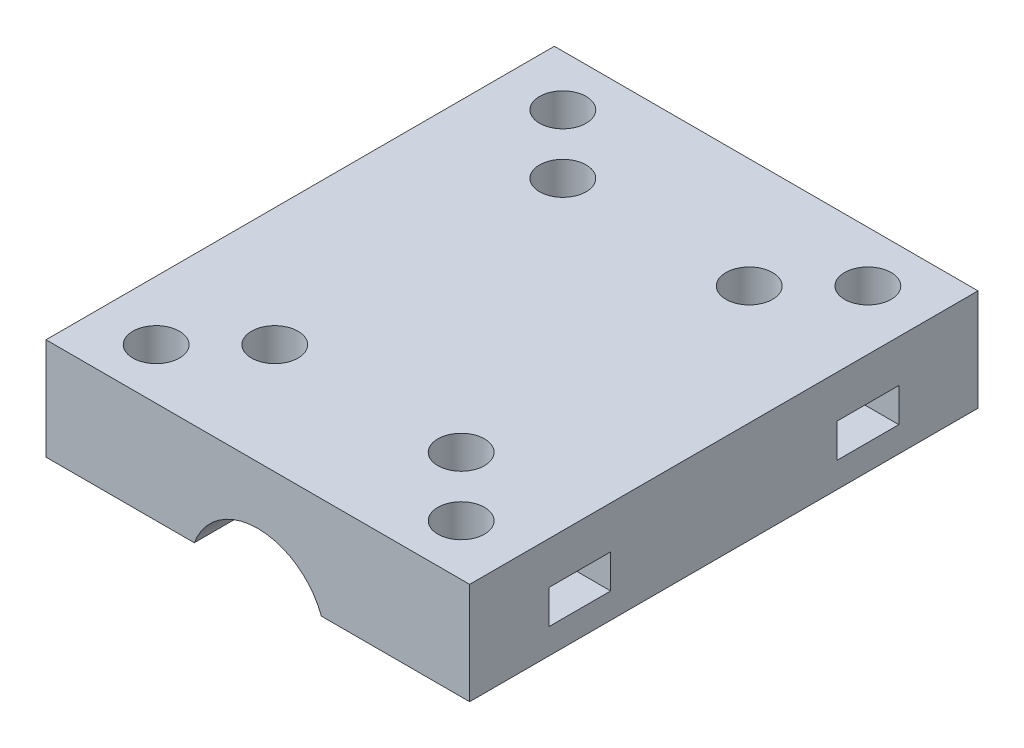
ISO-10303-21;
HEADER;
FILE_DESCRIPTION(('STEP AP214'),'2;1');
FILE_NAME('part.step','',(''),(''),'','','');
FILE_SCHEMA(('AUTOMOTIVE_DESIGN { 1 0 10303 214 1 1 1 1 }'));
ENDSEC;
DATA;
#1=APPLICATION_CONTEXT('core data for automotive mechanical design processes');
#2=APPLICATION_PROTOCOL_DEFINITION('international standard','automotive_design',2000,#1);
#3=PRODUCT_CONTEXT('',#1,'mechanical');
#4=PRODUCT('Part','Part','',(#3));
#5=PRODUCT_RELATED_PRODUCT_CATEGORY('part','',(#4));
#6=PRODUCT_DEFINITION_FORMATION('','',#4);
#7=PRODUCT_DEFINITION_CONTEXT('part definition',#1,'design');
#8=PRODUCT_DEFINITION('design','',#6,#7);
#9=PRODUCT_DEFINITION_SHAPE('','',#8);
#10=(LENGTH_UNIT() NAMED_UNIT(*) SI_UNIT(.MILLI.,.METRE.));
#11=(NAMED_UNIT(*) PLANE_ANGLE_UNIT() SI_UNIT($,.RADIAN.));
#12=(NAMED_UNIT(*) SI_UNIT($,.STERADIAN.) SOLID_ANGLE_UNIT());
#13=UNCERTAINTY_MEASURE_WITH_UNIT(LENGTH_MEASURE(1.E-05),#10,'distance_accuracy_value','');
#14=(GEOMETRIC_REPRESENTATION_CONTEXT(3) GLOBAL_UNCERTAINTY_ASSIGNED_CONTEXT((#13)) GLOBAL_UNIT_ASSIGNED_CONTEXT((#10,
#11,#12)) REPRESENTATION_CONTEXT('',''));
#15=CARTESIAN_POINT('',(0.,0.,0.));
#16=DIRECTION('',(0.,0.,1.));
#17=DIRECTION('',(1.,0.,0.));
#18=AXIS2_PLACEMENT_3D('',#15,#16,#17);
#19=CARTESIAN_POINT('',(36.,0.,-47.));
#20=DIRECTION('',(0.,-1.,0.));
#21=DIRECTION('',(0.,0.,-1.));
#22=AXIS2_PLACEMENT_3D('',#19,#20,#21);
#23=CYLINDRICAL_SURFACE('',#22,2.75);
#24=CARTESIAN_POINT('',(36.,7.00000000000001,-47.));
#25=DIRECTION('',(0.,1.,0.));
#26=DIRECTION('',(0.,0.,1.));
#27=AXIS2_PLACEMENT_3D('',#24,#25,#26);
#28=CIRCLE('',#27,2.75);
#29=CARTESIAN_POINT('',(36.,7.00000000000001,-44.25));
#30=VERTEX_POINT('',#29);
#31=EDGE_CURVE('E37',#30,#30,#28,.F.);
#32=ORIENTED_EDGE('',*,*,#31,.T.);
#33=EDGE_LOOP('',(#32));
#34=FACE_BOUND('',#33,.T.);
#35=CARTESIAN_POINT('',(36.,12.,-47.));
#36=DIRECTION('',(0.,-1.,0.));
#37=DIRECTION('',(0.,0.,-1.));
#38=AXIS2_PLACEMENT_3D('',#35,#36,#37);
#39=CIRCLE('',#38,2.75);
#40=CARTESIAN_POINT('',(36.,12.,-49.75));
#41=VERTEX_POINT('',#40);
#42=EDGE_CURVE('E346',#41,#41,#39,.T.);
#43=ORIENTED_EDGE('',*,*,#42,.F.);
#44=EDGE_LOOP('',(#43));
#45=FACE_BOUND('',#44,.T.);
#46=ADVANCED_FACE('F33',(#34,#45),#23,.F.);
#47=CARTESIAN_POINT('',(36.,0.,-13.));
#48=DIRECTION('',(0.,-1.,0.));
#49=DIRECTION('',(0.,0.,-1.));
#50=AXIS2_PLACEMENT_3D('',#47,#48,#49);
#51=CYLINDRICAL_SURFACE('',#50,2.75);
#52=CARTESIAN_POINT('',(36.,7.,-13.));
#53=DIRECTION('',(0.,1.,0.));
#54=DIRECTION('',(0.,0.,1.));
#55=AXIS2_PLACEMENT_3D('',#52,#53,#54);
#56=CIRCLE('',#55,2.75);
#57=CARTESIAN_POINT('',(36.,7.,-10.25));
#58=VERTEX_POINT('',#57);
#59=EDGE_CURVE('E275',#58,#58,#56,.F.);
#60=ORIENTED_EDGE('',*,*,#59,.T.);
#61=EDGE_LOOP('',(#60));
#62=FACE_BOUND('',#61,.T.);
#63=CARTESIAN_POINT('',(36.,12.,-13.));
#64=DIRECTION('',(0.,-1.,0.));
#65=DIRECTION('',(0.,0.,-1.));
#66=AXIS2_PLACEMENT_3D('',#63,#64,#65);
#67=CIRCLE('',#66,2.75);
#68=CARTESIAN_POINT('',(36.,12.,-15.75));
#69=VERTEX_POINT('',#68);
#70=EDGE_CURVE('E336',#69,#69,#67,.T.);
#71=ORIENTED_EDGE('',*,*,#70,.F.);
#72=EDGE_LOOP('',(#71));
#73=FACE_BOUND('',#72,.T.);
#74=ADVANCED_FACE('F425',(#62,#73),#51,.F.);
#75=CARTESIAN_POINT('',(14.,0.,-13.));
#76=DIRECTION('',(0.,-1.,0.));
#77=DIRECTION('',(0.,0.,-1.));
#78=AXIS2_PLACEMENT_3D('',#75,#76,#77);
#79=CYLINDRICAL_SURFACE('',#78,2.74999999999999);
#80=CARTESIAN_POINT('',(14.,7.00000000000001,-13.));
#81=DIRECTION('',(0.,1.,0.));
#82=DIRECTION('',(0.,0.,1.));
#83=AXIS2_PLACEMENT_3D('',#80,#81,#82);
#84=CIRCLE('',#83,2.74999999999999);
#85=CARTESIAN_POINT('',(14.,7.00000000000001,-10.25));
#86=VERTEX_POINT('',#85);
#87=EDGE_CURVE('E309',#86,#86,#84,.F.);
#88=ORIENTED_EDGE('',*,*,#87,.T.);
#89=EDGE_LOOP('',(#88));
#90=FACE_BOUND('',#89,.T.);
#91=CARTESIAN_POINT('',(14.,12.,-13.));
#92=DIRECTION('',(0.,-1.,0.));
#93=DIRECTION('',(0.,0.,-1.));
#94=AXIS2_PLACEMENT_3D('',#91,#92,#93);
#95=CIRCLE('',#94,2.74999999999999);
#96=CARTESIAN_POINT('',(14.,12.,-15.75));
#97=VERTEX_POINT('',#96);
#98=EDGE_CURVE('E329',#97,#97,#95,.T.);
#99=ORIENTED_EDGE('',*,*,#98,.F.);
#100=EDGE_LOOP('',(#99));
#101=FACE_BOUND('',#100,.T.);
#102=ADVANCED_FACE('F431',(#90,#101),#79,.F.);
#103=CARTESIAN_POINT('',(14.,0.,-47.));
#104=DIRECTION('',(0.,-1.,0.));
#105=DIRECTION('',(0.,0.,-1.));
#106=AXIS2_PLACEMENT_3D('',#103,#104,#105);
#107=CYLINDRICAL_SURFACE('',#106,2.75);
#108=CARTESIAN_POINT('',(14.,7.,-47.));
#109=DIRECTION('',(0.,1.,0.));
#110=DIRECTION('',(0.,0.,1.));
#111=AXIS2_PLACEMENT_3D('',#108,#109,#110);
#112=CIRCLE('',#111,2.75);
#113=CARTESIAN_POINT('',(14.,7.,-44.25));
#114=VERTEX_POINT('',#113);
#115=EDGE_CURVE('E330',#114,#114,#112,.F.);
#116=ORIENTED_EDGE('',*,*,#115,.T.);
#117=EDGE_LOOP('',(#116));
#118=FACE_BOUND('',#117,.T.);
#119=CARTESIAN_POINT('',(14.,12.,-47.));
#120=DIRECTION('',(0.,-1.,0.));
#121=DIRECTION('',(0.,0.,-1.));
#122=AXIS2_PLACEMENT_3D('',#119,#120,#121);
#123=CIRCLE('',#122,2.75);
#124=CARTESIAN_POINT('',(14.,12.,-49.75));
#125=VERTEX_POINT('',#124);
#126=EDGE_CURVE('E342',#125,#125,#123,.T.);
#127=ORIENTED_EDGE('',*,*,#126,.F.);
#128=EDGE_LOOP('',(#127));
#129=FACE_BOUND('',#128,.T.);
#130=ADVANCED_FACE('F445',(#118,#129),#107,.F.);
#131=CARTESIAN_POINT('',(0.,0.,-60.));
#132=DIRECTION('',(0.,-1.,0.));
#133=DIRECTION('',(0.,0.,-1.));
#134=AXIS2_PLACEMENT_3D('',#131,#132,#133);
#135=PLANE('',#134);
#136=CARTESIAN_POINT('',(43.,0.,-6.));
#137=DIRECTION('',(0.,1.,0.));
#138=DIRECTION('',(0.,0.,1.));
#139=AXIS2_PLACEMENT_3D('',#136,#137,#138);
#140=CIRCLE('',#139,2.75);
#141=CARTESIAN_POINT('',(43.,0.,-3.25));
#142=VERTEX_POINT('',#141);
#143=EDGE_CURVE('E870',#142,#142,#140,.T.);
#144=ORIENTED_EDGE('',*,*,#143,.T.);
#145=EDGE_LOOP('',(#144));
#146=FACE_BOUND('',#145,.T.);
#147=CARTESIAN_POINT('',(43.,0.,-54.));
#148=DIRECTION('',(0.,1.,0.));
#149=DIRECTION('',(0.,0.,1.));
#150=AXIS2_PLACEMENT_3D('',#147,#148,#149);
#151=CIRCLE('',#150,2.75);
#152=CARTESIAN_POINT('',(43.,0.,-51.25));
#153=VERTEX_POINT('',#152);
#154=EDGE_CURVE('E211',#153,#153,#151,.T.);
#155=ORIENTED_EDGE('',*,*,#154,.T.);
#156=EDGE_LOOP('',(#155));
#157=FACE_BOUND('',#156,.T.);
#158=CARTESIAN_POINT('',(36.,0.,-13.));
#159=DIRECTION('',(0.,-1.,0.));
#160=DIRECTION('',(0.,0.,-1.));
#161=AXIS2_PLACEMENT_3D('',#158,#159,#160);
#162=CIRCLE('',#161,2.75);
#163=CARTESIAN_POINT('',(36.,0.,-15.75));
#164=VERTEX_POINT('',#163);
#165=EDGE_CURVE('E333',#164,#164,#162,.T.);
#166=ORIENTED_EDGE('',*,*,#165,.F.);
#167=EDGE_LOOP('',(#166));
#168=FACE_BOUND('',#167,.T.);
#169=CARTESIAN_POINT('',(36.,0.,-47.));
#170=DIRECTION('',(0.,-1.,0.));
#171=DIRECTION('',(0.,0.,-1.));
#172=AXIS2_PLACEMENT_3D('',#169,#170,#171);
#173=CIRCLE('',#172,2.75);
#174=CARTESIAN_POINT('',(36.,0.,-49.75));
#175=VERTEX_POINT('',#174);
#176=EDGE_CURVE('E343',#175,#175,#173,.T.);
#177=ORIENTED_EDGE('',*,*,#176,.F.);
#178=EDGE_LOOP('',(#177));
#179=FACE_BOUND('',#178,.T.);
#180=DIRECTION('',(0.,0.,1.));
#181=VECTOR('',#180,1.);
#182=CARTESIAN_POINT('',(32.5,0.,-60.));
#183=LINE('',#182,#181);
#184=CARTESIAN_POINT('',(32.5,0.,-60.));
#185=VERTEX_POINT('',#184);
#186=CARTESIAN_POINT('',(32.5,0.,0.));
#187=VERTEX_POINT('',#186);
#188=EDGE_CURVE('E353',#185,#187,#183,.T.);
#189=ORIENTED_EDGE('',*,*,#188,.F.);
#190=DIRECTION('',(-1.,0.,0.));
#191=VECTOR('',#190,1.);
#192=CARTESIAN_POINT('',(0.,0.,-60.));
#193=LINE('',#192,#191);
#194=CARTESIAN_POINT('',(50.,0.,-60.));
#195=VERTEX_POINT('',#194);
#196=EDGE_CURVE('E362',#195,#185,#193,.T.);
#197=ORIENTED_EDGE('',*,*,#196,.F.);
#198=DIRECTION('',(0.,0.,-1.));
#199=VECTOR('',#198,1.);
#200=CARTESIAN_POINT('',(50.,0.,0.));
#201=LINE('',#200,#199);
#202=CARTESIAN_POINT('',(50.,0.,0.));
#203=VERTEX_POINT('',#202);
#204=EDGE_CURVE('E375',#203,#195,#201,.T.);
#205=ORIENTED_EDGE('',*,*,#204,.F.);
#206=DIRECTION('',(1.,0.,0.));
#207=VECTOR('',#206,1.);
#208=CARTESIAN_POINT('',(0.,0.,0.));
#209=LINE('',#208,#207);
#210=EDGE_CURVE('E371',#187,#203,#209,.T.);
#211=ORIENTED_EDGE('',*,*,#210,.F.);
#212=EDGE_LOOP('',(#189,#197,#205,#211));
#213=FACE_BOUND('',#212,.T.);
#214=ADVANCED_FACE('F451',(#146,#157,#168,#179,#213),#135,.T.);
#215=CARTESIAN_POINT('',(0.,12.,0.));
#216=DIRECTION('',(1.,0.,0.));
#217=DIRECTION('',(0.,0.,-1.));
#218=AXIS2_PLACEMENT_3D('',#215,#216,#217);
#219=PLANE('',#218);
#220=DIRECTION('',(0.,-1.,0.));
#221=VECTOR('',#220,1.);
#222=CARTESIAN_POINT('',(0.,7.00000000000001,-16.65));
#223=LINE('',#222,#221);
#224=CARTESIAN_POINT('',(0.,7.00000000000001,-16.65));
#225=VERTEX_POINT('',#224);
#226=CARTESIAN_POINT('',(0.,3.00000000000001,-16.65));
#227=VERTEX_POINT('',#226);
#228=EDGE_CURVE('E274',#225,#227,#223,.T.);
#229=ORIENTED_EDGE('',*,*,#228,.F.);
#230=DIRECTION('',(0.,0.,-1.));
#231=VECTOR('',#230,1.);
#232=CARTESIAN_POINT('',(0.,7.00000000000001,-16.65));
#233=LINE('',#232,#231);
#234=CARTESIAN_POINT('',(0.,7.00000000000001,-9.35));
#235=VERTEX_POINT('',#234);
#236=EDGE_CURVE('E272',#235,#225,#233,.T.);
#237=ORIENTED_EDGE('',*,*,#236,.F.);
#238=DIRECTION('',(0.,1.,0.));
#239=VECTOR('',#238,1.);
#240=CARTESIAN_POINT('',(0.,7.00000000000001,-9.35));
#241=LINE('',#240,#239);
#242=CARTESIAN_POINT('',(0.,3.00000000000001,-9.35));
#243=VERTEX_POINT('',#242);
#244=EDGE_CURVE('E262',#243,#235,#241,.T.);
#245=ORIENTED_EDGE('',*,*,#244,.F.);
#246=DIRECTION('',(0.,0.,1.));
#247=VECTOR('',#246,1.);
#248=CARTESIAN_POINT('',(0.,3.00000000000001,-16.65));
#249=LINE('',#248,#247);
#250=EDGE_CURVE('E278',#227,#243,#249,.T.);
#251=ORIENTED_EDGE('',*,*,#250,.F.);
#252=EDGE_LOOP('',(#229,#237,#245,#251));
#253=FACE_BOUND('',#252,.T.);
#254=DIRECTION('',(0.,-1.,0.));
#255=VECTOR('',#254,1.);
#256=CARTESIAN_POINT('',(0.,7.,-50.65));
#257=LINE('',#256,#255);
#258=CARTESIAN_POINT('',(0.,7.,-50.65));
#259=VERTEX_POINT('',#258);
#260=CARTESIAN_POINT('',(0.,3.,-50.65));
#261=VERTEX_POINT('',#260);
#262=EDGE_CURVE('E308',#259,#261,#257,.T.);
#263=ORIENTED_EDGE('',*,*,#262,.F.);
#264=DIRECTION('',(0.,0.,-1.));
#265=VECTOR('',#264,1.);
#266=CARTESIAN_POINT('',(0.,7.,-50.65));
#267=LINE('',#266,#265);
#268=CARTESIAN_POINT('',(0.,7.,-43.35));
#269=VERTEX_POINT('',#268);
#270=EDGE_CURVE('E306',#269,#259,#267,.T.);
#271=ORIENTED_EDGE('',*,*,#270,.F.);
#272=DIRECTION('',(0.,1.,0.));
#273=VECTOR('',#272,1.);
#274=CARTESIAN_POINT('',(0.,7.,-43.35));
#275=LINE('',#274,#273);
#276=CARTESIAN_POINT('',(0.,3.,-43.35));
#277=VERTEX_POINT('',#276);
#278=EDGE_CURVE('E296',#277,#269,#275,.T.);
#279=ORIENTED_EDGE('',*,*,#278,.F.);
#280=DIRECTION('',(0.,0.,1.));
#281=VECTOR('',#280,1.);
#282=CARTESIAN_POINT('',(0.,3.,-50.65));
#283=LINE('',#282,#281);
#284=EDGE_CURVE('E312',#261,#277,#283,.T.);
#285=ORIENTED_EDGE('',*,*,#284,.F.);
#286=EDGE_LOOP('',(#263,#271,#279,#285));
#287=FACE_BOUND('',#286,.T.);
#288=DIRECTION('',(0.,0.,1.));
#289=VECTOR('',#288,1.);
#290=CARTESIAN_POINT('',(0.,0.,0.));
#291=LINE('',#290,#289);
#292=CARTESIAN_POINT('',(0.,0.,-60.));
#293=VERTEX_POINT('',#292);
#294=CARTESIAN_POINT('',(0.,0.,0.));
#295=VERTEX_POINT('',#294);
#296=EDGE_CURVE('E355',#293,#295,#291,.T.);
#297=ORIENTED_EDGE('',*,*,#296,.T.);
#298=DIRECTION('',(0.,-1.,0.));
#299=VECTOR('',#298,1.);
#300=CARTESIAN_POINT('',(0.,12.,0.));
#301=LINE('',#300,#299);
#302=CARTESIAN_POINT('',(0.,12.,0.));
#303=VERTEX_POINT('',#302);
#304=EDGE_CURVE('E11',#303,#295,#301,.T.);
#305=ORIENTED_EDGE('',*,*,#304,.F.);
#306=DIRECTION('',(0.,0.,1.));
#307=VECTOR('',#306,1.);
#308=CARTESIAN_POINT('',(0.,12.,0.));
#309=LINE('',#308,#307);
#310=CARTESIAN_POINT('',(0.,12.,-60.));
#311=VERTEX_POINT('',#310);
#312=EDGE_CURVE('E358',#311,#303,#309,.T.);
#313=ORIENTED_EDGE('',*,*,#312,.F.);
#314=DIRECTION('',(0.,-1.,0.));
#315=VECTOR('',#314,1.);
#316=CARTESIAN_POINT('',(0.,12.,-60.));
#317=LINE('',#316,#315);
#318=EDGE_CURVE('E368',#311,#293,#317,.T.);
#319=ORIENTED_EDGE('',*,*,#318,.T.);
#320=EDGE_LOOP('',(#297,#305,#313,#319));
#321=FACE_BOUND('',#320,.T.);
#322=ADVANCED_FACE('F35',(#253,#287,#321),#219,.F.);
#323=CARTESIAN_POINT('',(0.,12.,0.));
#324=DIRECTION('',(0.,0.,-1.));
#325=DIRECTION('',(-1.,0.,0.));
#326=AXIS2_PLACEMENT_3D('',#323,#324,#325);
#327=PLANE('',#326);
#328=CARTESIAN_POINT('',(17.5,0.,0.));
#329=VERTEX_POINT('',#328);
#330=EDGE_CURVE('E372',#295,#329,#209,.T.);
#331=ORIENTED_EDGE('',*,*,#330,.T.);
#332=CARTESIAN_POINT('',(25.,-2.78388218141501,0.));
#333=DIRECTION('',(0.,0.,1.));
#334=DIRECTION('',(-1.,0.,0.));
#335=AXIS2_PLACEMENT_3D('',#332,#333,#334);
#336=CIRCLE('',#335,8.);
#337=EDGE_CURVE('E351',#187,#329,#336,.T.);
#338=ORIENTED_EDGE('',*,*,#337,.F.);
#339=ORIENTED_EDGE('',*,*,#210,.T.);
#340=DIRECTION('',(0.,-1.,0.));
#341=VECTOR('',#340,1.);
#342=CARTESIAN_POINT('',(50.,12.,0.));
#343=LINE('',#342,#341);
#344=CARTESIAN_POINT('',(50.,12.,0.));
#345=VERTEX_POINT('',#344);
#346=EDGE_CURVE('E42',#345,#203,#343,.T.);
#347=ORIENTED_EDGE('',*,*,#346,.F.);
#348=DIRECTION('',(1.,0.,0.));
#349=VECTOR('',#348,1.);
#350=CARTESIAN_POINT('',(0.,12.,0.));
#351=LINE('',#350,#349);
#352=EDGE_CURVE('E361',#303,#345,#351,.T.);
#353=ORIENTED_EDGE('',*,*,#352,.F.);
#354=ORIENTED_EDGE('',*,*,#304,.T.);
#355=EDGE_LOOP('',(#331,#338,#339,#347,#353,#354));
#356=FACE_BOUND('',#355,.T.);
#357=ADVANCED_FACE('F472',(#356),#327,.F.);
#358=CARTESIAN_POINT('',(50.,12.,0.));
#359=DIRECTION('',(-1.,0.,0.));
#360=DIRECTION('',(0.,0.,1.));
#361=AXIS2_PLACEMENT_3D('',#358,#359,#360);
#362=PLANE('',#361);
#363=DIRECTION('',(0.,-1.,0.));
#364=VECTOR('',#363,1.);
#365=CARTESIAN_POINT('',(50.,7.00000000000001,-43.35));
#366=LINE('',#365,#364);
#367=CARTESIAN_POINT('',(50.,7.00000000000001,-43.35));
#368=VERTEX_POINT('',#367);
#369=CARTESIAN_POINT('',(50.,3.00000000000001,-43.35));
#370=VERTEX_POINT('',#369);
#371=EDGE_CURVE('E217',#368,#370,#366,.T.);
#372=ORIENTED_EDGE('',*,*,#371,.F.);
#373=DIRECTION('',(0.,0.,1.));
#374=VECTOR('',#373,1.);
#375=CARTESIAN_POINT('',(50.,7.00000000000001,-43.35));
#376=LINE('',#375,#374);
#377=CARTESIAN_POINT('',(50.,7.00000000000001,-50.65));
#378=VERTEX_POINT('',#377);
#379=EDGE_CURVE('E50',#378,#368,#376,.T.);
#380=ORIENTED_EDGE('',*,*,#379,.F.);
#381=DIRECTION('',(0.,1.,0.));
#382=VECTOR('',#381,1.);
#383=CARTESIAN_POINT('',(50.,7.00000000000001,-50.65));
#384=LINE('',#383,#382);
#385=CARTESIAN_POINT('',(50.,3.00000000000001,-50.65));
#386=VERTEX_POINT('',#385);
#387=EDGE_CURVE('E205',#386,#378,#384,.T.);
#388=ORIENTED_EDGE('',*,*,#387,.F.);
#389=DIRECTION('',(0.,0.,-1.));
#390=VECTOR('',#389,1.);
#391=CARTESIAN_POINT('',(50.,3.00000000000001,-43.35));
#392=LINE('',#391,#390);
#393=EDGE_CURVE('E208',#370,#386,#392,.T.);
#394=ORIENTED_EDGE('',*,*,#393,.F.);
#395=EDGE_LOOP('',(#372,#380,#388,#394));
#396=FACE_BOUND('',#395,.T.);
#397=DIRECTION('',(0.,-1.,0.));
#398=VECTOR('',#397,1.);
#399=CARTESIAN_POINT('',(50.,7.,-9.35));
#400=LINE('',#399,#398);
#401=CARTESIAN_POINT('',(50.,7.,-9.35));
#402=VERTEX_POINT('',#401);
#403=CARTESIAN_POINT('',(50.,3.,-9.35));
#404=VERTEX_POINT('',#403);
#405=EDGE_CURVE('E242',#402,#404,#400,.T.);
#406=ORIENTED_EDGE('',*,*,#405,.F.);
#407=DIRECTION('',(0.,0.,1.));
#408=VECTOR('',#407,1.);
#409=CARTESIAN_POINT('',(50.,7.,-9.35));
#410=LINE('',#409,#408);
#411=CARTESIAN_POINT('',(50.,7.,-16.65));
#412=VERTEX_POINT('',#411);
#413=EDGE_CURVE('E58',#412,#402,#410,.T.);
#414=ORIENTED_EDGE('',*,*,#413,.F.);
#415=DIRECTION('',(0.,1.,0.));
#416=VECTOR('',#415,1.);
#417=CARTESIAN_POINT('',(50.,7.,-16.65));
#418=LINE('',#417,#416);
#419=CARTESIAN_POINT('',(50.,3.,-16.65));
#420=VERTEX_POINT('',#419);
#421=EDGE_CURVE('E231',#420,#412,#418,.T.);
#422=ORIENTED_EDGE('',*,*,#421,.F.);
#423=DIRECTION('',(0.,0.,-1.));
#424=VECTOR('',#423,1.);
#425=CARTESIAN_POINT('',(50.,3.,-9.35));
#426=LINE('',#425,#424);
#427=EDGE_CURVE('E245',#404,#420,#426,.T.);
#428=ORIENTED_EDGE('',*,*,#427,.F.);
#429=EDGE_LOOP('',(#406,#414,#422,#428));
#430=FACE_BOUND('',#429,.T.);
#431=ORIENTED_EDGE('',*,*,#204,.T.);
#432=DIRECTION('',(0.,-1.,0.));
#433=VECTOR('',#432,1.);
#434=CARTESIAN_POINT('',(50.,12.,-60.));
#435=LINE('',#434,#433);
#436=CARTESIAN_POINT('',(50.,12.,-60.));
#437=VERTEX_POINT('',#436);
#438=EDGE_CURVE('E382',#437,#195,#435,.T.);
#439=ORIENTED_EDGE('',*,*,#438,.F.);
#440=DIRECTION('',(0.,0.,-1.));
#441=VECTOR('',#440,1.);
#442=CARTESIAN_POINT('',(50.,12.,0.));
#443=LINE('',#442,#441);
#444=EDGE_CURVE('E364',#345,#437,#443,.T.);
#445=ORIENTED_EDGE('',*,*,#444,.F.);
#446=ORIENTED_EDGE('',*,*,#346,.T.);
#447=EDGE_LOOP('',(#431,#439,#445,#446));
#448=FACE_BOUND('',#447,.T.);
#449=ADVANCED_FACE('F469',(#396,#430,#448),#362,.F.);
#450=CARTESIAN_POINT('',(0.,12.,-60.));
#451=DIRECTION('',(0.,0.,1.));
#452=DIRECTION('',(1.,0.,0.));
#453=AXIS2_PLACEMENT_3D('',#450,#451,#452);
#454=PLANE('',#453);
#455=ORIENTED_EDGE('',*,*,#196,.T.);
#456=CARTESIAN_POINT('',(25.,-2.78388218141501,-60.));
#457=DIRECTION('',(0.,0.,1.));
#458=DIRECTION('',(-1.,0.,0.));
#459=AXIS2_PLACEMENT_3D('',#456,#457,#458);
#460=CIRCLE('',#459,8.);
#461=CARTESIAN_POINT('',(17.5,0.,-60.));
#462=VERTEX_POINT('',#461);
#463=EDGE_CURVE('E347',#185,#462,#460,.T.);
#464=ORIENTED_EDGE('',*,*,#463,.T.);
#465=EDGE_CURVE('E377',#462,#293,#193,.T.);
#466=ORIENTED_EDGE('',*,*,#465,.T.);
#467=ORIENTED_EDGE('',*,*,#318,.F.);
#468=DIRECTION('',(-1.,0.,0.));
#469=VECTOR('',#468,1.);
#470=CARTESIAN_POINT('',(0.,12.,-60.));
#471=LINE('',#470,#469);
#472=EDGE_CURVE('E366',#437,#311,#471,.T.);
#473=ORIENTED_EDGE('',*,*,#472,.F.);
#474=ORIENTED_EDGE('',*,*,#438,.T.);
#475=EDGE_LOOP('',(#455,#464,#466,#467,#473,#474));
#476=FACE_BOUND('',#475,.T.);
#477=ADVANCED_FACE('F462',(#476),#454,.F.);
#478=CARTESIAN_POINT('',(0.,12.,-60.));
#479=DIRECTION('',(0.,-1.,0.));
#480=DIRECTION('',(0.,0.,-1.));
#481=AXIS2_PLACEMENT_3D('',#478,#479,#480);
#482=PLANE('',#481);
#483=CARTESIAN_POINT('',(43.,12.,-6.));
#484=DIRECTION('',(0.,1.,0.));
#485=DIRECTION('',(0.,0.,1.));
#486=AXIS2_PLACEMENT_3D('',#483,#484,#485);
#487=CIRCLE('',#486,2.74999999999999);
#488=CARTESIAN_POINT('',(43.,12.,-3.25000000000001));
#489=VERTEX_POINT('',#488);
#490=EDGE_CURVE('E872',#489,#489,#487,.T.);
#491=ORIENTED_EDGE('',*,*,#490,.F.);
#492=EDGE_LOOP('',(#491));
#493=FACE_BOUND('',#492,.T.);
#494=CARTESIAN_POINT('',(6.99999999999999,12.,-6.));
#495=DIRECTION('',(0.,1.,0.));
#496=DIRECTION('',(0.,0.,1.));
#497=AXIS2_PLACEMENT_3D('',#494,#495,#496);
#498=CIRCLE('',#497,2.74999999999999);
#499=CARTESIAN_POINT('',(6.99999999999999,12.,-3.25000000000001));
#500=VERTEX_POINT('',#499);
#501=EDGE_CURVE('E874',#500,#500,#498,.T.);
#502=ORIENTED_EDGE('',*,*,#501,.F.);
#503=EDGE_LOOP('',(#502));
#504=FACE_BOUND('',#503,.T.);
#505=CARTESIAN_POINT('',(6.99999999999999,12.,-54.));
#506=DIRECTION('',(0.,1.,0.));
#507=DIRECTION('',(0.,0.,1.));
#508=AXIS2_PLACEMENT_3D('',#505,#506,#507);
#509=CIRCLE('',#508,2.74999999999999);
#510=CARTESIAN_POINT('',(6.99999999999999,12.,-51.25));
#511=VERTEX_POINT('',#510);
#512=EDGE_CURVE('E882',#511,#511,#509,.T.);
#513=ORIENTED_EDGE('',*,*,#512,.F.);
#514=EDGE_LOOP('',(#513));
#515=FACE_BOUND('',#514,.T.);
#516=CARTESIAN_POINT('',(43.,12.,-54.));
#517=DIRECTION('',(0.,1.,0.));
#518=DIRECTION('',(0.,0.,1.));
#519=AXIS2_PLACEMENT_3D('',#516,#517,#518);
#520=CIRCLE('',#519,2.74999999999999);
#521=CARTESIAN_POINT('',(43.,12.,-51.25));
#522=VERTEX_POINT('',#521);
#523=EDGE_CURVE('E887',#522,#522,#520,.T.);
#524=ORIENTED_EDGE('',*,*,#523,.F.);
#525=EDGE_LOOP('',(#524));
#526=FACE_BOUND('',#525,.T.);
#527=ORIENTED_EDGE('',*,*,#98,.T.);
#528=EDGE_LOOP('',(#527));
#529=FACE_BOUND('',#528,.T.);
#530=ORIENTED_EDGE('',*,*,#70,.T.);
#531=EDGE_LOOP('',(#530));
#532=FACE_BOUND('',#531,.T.);
#533=ORIENTED_EDGE('',*,*,#126,.T.);
#534=EDGE_LOOP('',(#533));
#535=FACE_BOUND('',#534,.T.);
#536=ORIENTED_EDGE('',*,*,#42,.T.);
#537=EDGE_LOOP('',(#536));
#538=FACE_BOUND('',#537,.T.);
#539=ORIENTED_EDGE('',*,*,#312,.T.);
#540=ORIENTED_EDGE('',*,*,#352,.T.);
#541=ORIENTED_EDGE('',*,*,#444,.T.);
#542=ORIENTED_EDGE('',*,*,#472,.T.);
#543=EDGE_LOOP('',(#539,#540,#541,#542));
#544=FACE_BOUND('',#543,.T.);
#545=ADVANCED_FACE('F479',(#493,#504,#515,#526,#529,#532,#535,#538,#544),#482,.F.);
#546=CARTESIAN_POINT('',(6.99999999999999,0.,-6.));
#547=DIRECTION('',(0.,1.,0.));
#548=DIRECTION('',(0.,0.,1.));
#549=AXIS2_PLACEMENT_3D('',#546,#547,#548);
#550=CIRCLE('',#549,2.75);
#551=CARTESIAN_POINT('',(6.99999999999999,0.,-3.25));
#552=VERTEX_POINT('',#551);
#553=EDGE_CURVE('E879',#552,#552,#550,.T.);
#554=ORIENTED_EDGE('',*,*,#553,.T.);
#555=EDGE_LOOP('',(#554));
#556=FACE_BOUND('',#555,.T.);
#557=CARTESIAN_POINT('',(6.99999999999999,0.,-54.));
#558=DIRECTION('',(0.,1.,0.));
#559=DIRECTION('',(0.,0.,1.));
#560=AXIS2_PLACEMENT_3D('',#557,#558,#559);
#561=CIRCLE('',#560,2.75);
#562=CARTESIAN_POINT('',(6.99999999999999,0.,-51.25));
#563=VERTEX_POINT('',#562);
#564=EDGE_CURVE('E885',#563,#563,#561,.T.);
#565=ORIENTED_EDGE('',*,*,#564,.T.);
#566=EDGE_LOOP('',(#565));
#567=FACE_BOUND('',#566,.T.);
#568=CARTESIAN_POINT('',(14.,0.,-13.));
#569=DIRECTION('',(0.,-1.,0.));
#570=DIRECTION('',(0.,0.,-1.));
#571=AXIS2_PLACEMENT_3D('',#568,#569,#570);
#572=CIRCLE('',#571,2.75);
#573=CARTESIAN_POINT('',(14.,0.,-15.75));
#574=VERTEX_POINT('',#573);
#575=EDGE_CURVE('E326',#574,#574,#572,.T.);
#576=ORIENTED_EDGE('',*,*,#575,.F.);
#577=EDGE_LOOP('',(#576));
#578=FACE_BOUND('',#577,.T.);
#579=CARTESIAN_POINT('',(14.,0.,-47.));
#580=DIRECTION('',(0.,-1.,0.));
#581=DIRECTION('',(0.,0.,-1.));
#582=AXIS2_PLACEMENT_3D('',#579,#580,#581);
#583=CIRCLE('',#582,2.75);
#584=CARTESIAN_POINT('',(14.,0.,-49.75));
#585=VERTEX_POINT('',#584);
#586=EDGE_CURVE('E339',#585,#585,#583,.T.);
#587=ORIENTED_EDGE('',*,*,#586,.F.);
#588=EDGE_LOOP('',(#587));
#589=FACE_BOUND('',#588,.T.);
#590=DIRECTION('',(0.,0.,1.));
#591=VECTOR('',#590,1.);
#592=CARTESIAN_POINT('',(17.5,0.,-60.));
#593=LINE('',#592,#591);
#594=EDGE_CURVE('E350',#462,#329,#593,.T.);
#595=ORIENTED_EDGE('',*,*,#594,.T.);
#596=ORIENTED_EDGE('',*,*,#330,.F.);
#597=ORIENTED_EDGE('',*,*,#296,.F.);
#598=ORIENTED_EDGE('',*,*,#465,.F.);
#599=EDGE_LOOP('',(#595,#596,#597,#598));
#600=FACE_BOUND('',#599,.T.);
#601=ADVANCED_FACE('F446',(#556,#567,#578,#589,#600),#135,.T.);
#602=CARTESIAN_POINT('',(25.,-2.78388218141501,-60.));
#603=DIRECTION('',(0.,0.,1.));
#604=DIRECTION('',(1.,0.,0.));
#605=AXIS2_PLACEMENT_3D('',#602,#603,#604);
#606=CYLINDRICAL_SURFACE('',#605,8.);
#607=ORIENTED_EDGE('',*,*,#337,.T.);
#608=ORIENTED_EDGE('',*,*,#594,.F.);
#609=ORIENTED_EDGE('',*,*,#463,.F.);
#610=ORIENTED_EDGE('',*,*,#188,.T.);
#611=EDGE_LOOP('',(#607,#608,#609,#610));
#612=FACE_BOUND('',#611,.T.);
#613=ADVANCED_FACE('F439',(#612),#606,.F.);
#614=CARTESIAN_POINT('',(36.,3.00000000000001,-47.));
#615=DIRECTION('',(0.,-1.,0.));
#616=DIRECTION('',(0.,0.,-1.));
#617=AXIS2_PLACEMENT_3D('',#614,#615,#616);
#618=CIRCLE('',#617,2.75);
#619=CARTESIAN_POINT('',(36.,3.00000000000001,-49.75));
#620=VERTEX_POINT('',#619);
#621=EDGE_CURVE('E223',#620,#620,#618,.F.);
#622=ORIENTED_EDGE('',*,*,#621,.T.);
#623=EDGE_LOOP('',(#622));
#624=FACE_BOUND('',#623,.T.);
#625=ORIENTED_EDGE('',*,*,#176,.T.);
#626=EDGE_LOOP('',(#625));
#627=FACE_BOUND('',#626,.T.);
#628=ADVANCED_FACE('F427',(#624,#627),#23,.F.);
#629=CARTESIAN_POINT('',(14.,3.,-47.));
#630=DIRECTION('',(0.,-1.,0.));
#631=DIRECTION('',(0.,0.,-1.));
#632=AXIS2_PLACEMENT_3D('',#629,#630,#631);
#633=CIRCLE('',#632,2.75);
#634=CARTESIAN_POINT('',(14.,3.,-49.75));
#635=VERTEX_POINT('',#634);
#636=EDGE_CURVE('E319',#635,#635,#633,.F.);
#637=ORIENTED_EDGE('',*,*,#636,.T.);
#638=EDGE_LOOP('',(#637));
#639=FACE_BOUND('',#638,.T.);
#640=ORIENTED_EDGE('',*,*,#586,.T.);
#641=EDGE_LOOP('',(#640));
#642=FACE_BOUND('',#641,.T.);
#643=ADVANCED_FACE('F438',(#639,#642),#107,.F.);
#644=CARTESIAN_POINT('',(36.,3.,-13.));
#645=DIRECTION('',(0.,-1.,0.));
#646=DIRECTION('',(0.,0.,-1.));
#647=AXIS2_PLACEMENT_3D('',#644,#645,#646);
#648=CIRCLE('',#647,2.75);
#649=CARTESIAN_POINT('',(36.,3.,-15.75));
#650=VERTEX_POINT('',#649);
#651=EDGE_CURVE('E252',#650,#650,#648,.F.);
#652=ORIENTED_EDGE('',*,*,#651,.T.);
#653=EDGE_LOOP('',(#652));
#654=FACE_BOUND('',#653,.T.);
#655=ORIENTED_EDGE('',*,*,#165,.T.);
#656=EDGE_LOOP('',(#655));
#657=FACE_BOUND('',#656,.T.);
#658=ADVANCED_FACE('F434',(#654,#657),#51,.F.);
#659=CARTESIAN_POINT('',(14.,3.00000000000001,-13.));
#660=DIRECTION('',(0.,-1.,0.));
#661=DIRECTION('',(0.,0.,-1.));
#662=AXIS2_PLACEMENT_3D('',#659,#660,#661);
#663=CIRCLE('',#662,2.74999999999999);
#664=CARTESIAN_POINT('',(14.,3.00000000000001,-15.75));
#665=VERTEX_POINT('',#664);
#666=EDGE_CURVE('E285',#665,#665,#663,.F.);
#667=ORIENTED_EDGE('',*,*,#666,.T.);
#668=EDGE_LOOP('',(#667));
#669=FACE_BOUND('',#668,.T.);
#670=ORIENTED_EDGE('',*,*,#575,.T.);
#671=EDGE_LOOP('',(#670));
#672=FACE_BOUND('',#671,.T.);
#673=ADVANCED_FACE('F544',(#669,#672),#79,.F.);
#674=CARTESIAN_POINT('',(17.3,7.,-50.65));
#675=DIRECTION('',(0.,1.,0.));
#676=DIRECTION('',(0.,0.,1.));
#677=AXIS2_PLACEMENT_3D('',#674,#675,#676);
#678=PLANE('',#677);
#679=ORIENTED_EDGE('',*,*,#270,.T.);
#680=DIRECTION('',(-1.,0.,0.));
#681=VECTOR('',#680,1.);
#682=CARTESIAN_POINT('',(17.3,7.,-50.65));
#683=LINE('',#682,#681);
#684=CARTESIAN_POINT('',(17.3,7.,-50.65));
#685=VERTEX_POINT('',#684);
#686=EDGE_CURVE('E305',#685,#259,#683,.T.);
#687=ORIENTED_EDGE('',*,*,#686,.F.);
#688=DIRECTION('',(0.,0.,-1.));
#689=VECTOR('',#688,1.);
#690=CARTESIAN_POINT('',(17.3,7.,-50.65));
#691=LINE('',#690,#689);
#692=CARTESIAN_POINT('',(17.3,7.,-43.35));
#693=VERTEX_POINT('',#692);
#694=EDGE_CURVE('E292',#693,#685,#691,.T.);
#695=ORIENTED_EDGE('',*,*,#694,.F.);
#696=DIRECTION('',(-1.,0.,0.));
#697=VECTOR('',#696,1.);
#698=CARTESIAN_POINT('',(17.3,7.,-43.35));
#699=LINE('',#698,#697);
#700=EDGE_CURVE('E317',#693,#269,#699,.T.);
#701=ORIENTED_EDGE('',*,*,#700,.T.);
#702=EDGE_LOOP('',(#679,#687,#695,#701));
#703=FACE_BOUND('',#702,.T.);
#704=ORIENTED_EDGE('',*,*,#115,.F.);
#705=EDGE_LOOP('',(#704));
#706=FACE_BOUND('',#705,.T.);
#707=ADVANCED_FACE('F515',(#703,#706),#678,.F.);
#708=CARTESIAN_POINT('',(17.3,3.,-50.65));
#709=DIRECTION('',(0.,-1.,0.));
#710=DIRECTION('',(0.,0.,-1.));
#711=AXIS2_PLACEMENT_3D('',#708,#709,#710);
#712=PLANE('',#711);
#713=ORIENTED_EDGE('',*,*,#284,.T.);
#714=DIRECTION('',(-1.,0.,0.));
#715=VECTOR('',#714,1.);
#716=CARTESIAN_POINT('',(17.3,3.,-43.35));
#717=LINE('',#716,#715);
#718=CARTESIAN_POINT('',(17.3,3.,-43.35));
#719=VERTEX_POINT('',#718);
#720=EDGE_CURVE('E320',#719,#277,#717,.T.);
#721=ORIENTED_EDGE('',*,*,#720,.F.);
#722=DIRECTION('',(0.,0.,1.));
#723=VECTOR('',#722,1.);
#724=CARTESIAN_POINT('',(17.3,3.,-50.65));
#725=LINE('',#724,#723);
#726=CARTESIAN_POINT('',(17.3,3.,-50.65));
#727=VERTEX_POINT('',#726);
#728=EDGE_CURVE('E299',#727,#719,#725,.T.);
#729=ORIENTED_EDGE('',*,*,#728,.F.);
#730=DIRECTION('',(-1.,0.,0.));
#731=VECTOR('',#730,1.);
#732=CARTESIAN_POINT('',(17.3,3.,-50.65));
#733=LINE('',#732,#731);
#734=EDGE_CURVE('E322',#727,#261,#733,.T.);
#735=ORIENTED_EDGE('',*,*,#734,.T.);
#736=EDGE_LOOP('',(#713,#721,#729,#735));
#737=FACE_BOUND('',#736,.T.);
#738=ORIENTED_EDGE('',*,*,#636,.F.);
#739=EDGE_LOOP('',(#738));
#740=FACE_BOUND('',#739,.T.);
#741=ADVANCED_FACE('F521',(#737,#740),#712,.F.);
#742=CARTESIAN_POINT('',(17.3,7.,-43.35));
#743=DIRECTION('',(0.,0.,1.));
#744=DIRECTION('',(1.,0.,0.));
#745=AXIS2_PLACEMENT_3D('',#742,#743,#744);
#746=PLANE('',#745);
#747=ORIENTED_EDGE('',*,*,#278,.T.);
#748=ORIENTED_EDGE('',*,*,#700,.F.);
#749=DIRECTION('',(0.,1.,0.));
#750=VECTOR('',#749,1.);
#751=CARTESIAN_POINT('',(17.3,7.,-43.35));
#752=LINE('',#751,#750);
#753=EDGE_CURVE('E302',#719,#693,#752,.T.);
#754=ORIENTED_EDGE('',*,*,#753,.F.);
#755=ORIENTED_EDGE('',*,*,#720,.T.);
#756=EDGE_LOOP('',(#747,#748,#754,#755));
#757=FACE_BOUND('',#756,.T.);
#758=ADVANCED_FACE('F519',(#757),#746,.F.);
#759=CARTESIAN_POINT('',(17.3,7.,-50.65));
#760=DIRECTION('',(0.,0.,-1.));
#761=DIRECTION('',(-1.,0.,0.));
#762=AXIS2_PLACEMENT_3D('',#759,#760,#761);
#763=PLANE('',#762);
#764=ORIENTED_EDGE('',*,*,#262,.T.);
#765=ORIENTED_EDGE('',*,*,#734,.F.);
#766=DIRECTION('',(0.,-1.,0.));
#767=VECTOR('',#766,1.);
#768=CARTESIAN_POINT('',(17.3,7.,-50.65));
#769=LINE('',#768,#767);
#770=EDGE_CURVE('E295',#685,#727,#769,.T.);
#771=ORIENTED_EDGE('',*,*,#770,.F.);
#772=ORIENTED_EDGE('',*,*,#686,.T.);
#773=EDGE_LOOP('',(#764,#765,#771,#772));
#774=FACE_BOUND('',#773,.T.);
#775=ADVANCED_FACE('F510',(#774),#763,.F.);
#776=CARTESIAN_POINT('',(17.3,7.,-43.35));
#777=DIRECTION('',(1.,0.,0.));
#778=DIRECTION('',(0.,0.,-1.));
#779=AXIS2_PLACEMENT_3D('',#776,#777,#778);
#780=PLANE('',#779);
#781=ORIENTED_EDGE('',*,*,#694,.T.);
#782=ORIENTED_EDGE('',*,*,#770,.T.);
#783=ORIENTED_EDGE('',*,*,#728,.T.);
#784=ORIENTED_EDGE('',*,*,#753,.T.);
#785=EDGE_LOOP('',(#781,#782,#783,#784));
#786=FACE_BOUND('',#785,.T.);
#787=ADVANCED_FACE('F524',(#786),#780,.F.);
#788=CARTESIAN_POINT('',(17.3,7.00000000000001,-16.65));
#789=DIRECTION('',(0.,1.,0.));
#790=DIRECTION('',(0.,0.,1.));
#791=AXIS2_PLACEMENT_3D('',#788,#789,#790);
#792=PLANE('',#791);
#793=ORIENTED_EDGE('',*,*,#236,.T.);
#794=DIRECTION('',(-1.,0.,0.));
#795=VECTOR('',#794,1.);
#796=CARTESIAN_POINT('',(17.3,7.00000000000001,-16.65));
#797=LINE('',#796,#795);
#798=CARTESIAN_POINT('',(17.3,7.00000000000001,-16.65));
#799=VERTEX_POINT('',#798);
#800=EDGE_CURVE('E271',#799,#225,#797,.T.);
#801=ORIENTED_EDGE('',*,*,#800,.F.);
#802=DIRECTION('',(0.,0.,-1.));
#803=VECTOR('',#802,1.);
#804=CARTESIAN_POINT('',(17.3,7.00000000000001,-16.65));
#805=LINE('',#804,#803);
#806=CARTESIAN_POINT('',(17.3,7.00000000000001,-9.35));
#807=VERTEX_POINT('',#806);
#808=EDGE_CURVE('E258',#807,#799,#805,.T.);
#809=ORIENTED_EDGE('',*,*,#808,.F.);
#810=DIRECTION('',(-1.,0.,0.));
#811=VECTOR('',#810,1.);
#812=CARTESIAN_POINT('',(17.3,7.00000000000001,-9.35));
#813=LINE('',#812,#811);
#814=EDGE_CURVE('E283',#807,#235,#813,.T.);
#815=ORIENTED_EDGE('',*,*,#814,.T.);
#816=EDGE_LOOP('',(#793,#801,#809,#815));
#817=FACE_BOUND('',#816,.T.);
#818=ORIENTED_EDGE('',*,*,#87,.F.);
#819=EDGE_LOOP('',(#818));
#820=FACE_BOUND('',#819,.T.);
#821=ADVANCED_FACE('F526',(#817,#820),#792,.F.);
#822=CARTESIAN_POINT('',(17.3,3.00000000000001,-16.65));
#823=DIRECTION('',(0.,-1.,0.));
#824=DIRECTION('',(0.,0.,-1.));
#825=AXIS2_PLACEMENT_3D('',#822,#823,#824);
#826=PLANE('',#825);
#827=ORIENTED_EDGE('',*,*,#250,.T.);
#828=DIRECTION('',(-1.,0.,0.));
#829=VECTOR('',#828,1.);
#830=CARTESIAN_POINT('',(17.3,3.00000000000001,-9.35));
#831=LINE('',#830,#829);
#832=CARTESIAN_POINT('',(17.3,3.00000000000001,-9.35));
#833=VERTEX_POINT('',#832);
#834=EDGE_CURVE('E286',#833,#243,#831,.T.);
#835=ORIENTED_EDGE('',*,*,#834,.F.);
#836=DIRECTION('',(0.,0.,1.));
#837=VECTOR('',#836,1.);
#838=CARTESIAN_POINT('',(17.3,3.00000000000001,-16.65));
#839=LINE('',#838,#837);
#840=CARTESIAN_POINT('',(17.3,3.00000000000001,-16.65));
#841=VERTEX_POINT('',#840);
#842=EDGE_CURVE('E265',#841,#833,#839,.T.);
#843=ORIENTED_EDGE('',*,*,#842,.F.);
#844=DIRECTION('',(-1.,0.,0.));
#845=VECTOR('',#844,1.);
#846=CARTESIAN_POINT('',(17.3,3.00000000000001,-16.65));
#847=LINE('',#846,#845);
#848=EDGE_CURVE('E288',#841,#227,#847,.T.);
#849=ORIENTED_EDGE('',*,*,#848,.T.);
#850=EDGE_LOOP('',(#827,#835,#843,#849));
#851=FACE_BOUND('',#850,.T.);
#852=ORIENTED_EDGE('',*,*,#666,.F.);
#853=EDGE_LOOP('',(#852));
#854=FACE_BOUND('',#853,.T.);
#855=ADVANCED_FACE('F532',(#851,#854),#826,.F.);
#856=CARTESIAN_POINT('',(17.3,7.00000000000001,-9.35));
#857=DIRECTION('',(0.,0.,1.));
#858=DIRECTION('',(1.,0.,0.));
#859=AXIS2_PLACEMENT_3D('',#856,#857,#858);
#860=PLANE('',#859);
#861=ORIENTED_EDGE('',*,*,#244,.T.);
#862=ORIENTED_EDGE('',*,*,#814,.F.);
#863=DIRECTION('',(0.,1.,0.));
#864=VECTOR('',#863,1.);
#865=CARTESIAN_POINT('',(17.3,7.00000000000001,-9.35));
#866=LINE('',#865,#864);
#867=EDGE_CURVE('E268',#833,#807,#866,.T.);
#868=ORIENTED_EDGE('',*,*,#867,.F.);
#869=ORIENTED_EDGE('',*,*,#834,.T.);
#870=EDGE_LOOP('',(#861,#862,#868,#869));
#871=FACE_BOUND('',#870,.T.);
#872=ADVANCED_FACE('F578',(#871),#860,.F.);
#873=CARTESIAN_POINT('',(17.3,7.00000000000001,-16.65));
#874=DIRECTION('',(0.,0.,-1.));
#875=DIRECTION('',(-1.,0.,0.));
#876=AXIS2_PLACEMENT_3D('',#873,#874,#875);
#877=PLANE('',#876);
#878=ORIENTED_EDGE('',*,*,#228,.T.);
#879=ORIENTED_EDGE('',*,*,#848,.F.);
#880=DIRECTION('',(0.,-1.,0.));
#881=VECTOR('',#880,1.);
#882=CARTESIAN_POINT('',(17.3,7.00000000000001,-16.65));
#883=LINE('',#882,#881);
#884=EDGE_CURVE('E261',#799,#841,#883,.T.);
#885=ORIENTED_EDGE('',*,*,#884,.F.);
#886=ORIENTED_EDGE('',*,*,#800,.T.);
#887=EDGE_LOOP('',(#878,#879,#885,#886));
#888=FACE_BOUND('',#887,.T.);
#889=ADVANCED_FACE('F576',(#888),#877,.F.);
#890=CARTESIAN_POINT('',(17.3,7.00000000000001,-9.35));
#891=DIRECTION('',(1.,0.,0.));
#892=DIRECTION('',(0.,0.,-1.));
#893=AXIS2_PLACEMENT_3D('',#890,#891,#892);
#894=PLANE('',#893);
#895=ORIENTED_EDGE('',*,*,#808,.T.);
#896=ORIENTED_EDGE('',*,*,#884,.T.);
#897=ORIENTED_EDGE('',*,*,#842,.T.);
#898=ORIENTED_EDGE('',*,*,#867,.T.);
#899=EDGE_LOOP('',(#895,#896,#897,#898));
#900=FACE_BOUND('',#899,.T.);
#901=ADVANCED_FACE('F568',(#900),#894,.F.);
#902=CARTESIAN_POINT('',(32.7,7.,-9.35));
#903=DIRECTION('',(0.,1.,0.));
#904=DIRECTION('',(0.,0.,1.));
#905=AXIS2_PLACEMENT_3D('',#902,#903,#904);
#906=PLANE('',#905);
#907=ORIENTED_EDGE('',*,*,#413,.T.);
#908=DIRECTION('',(1.,0.,0.));
#909=VECTOR('',#908,1.);
#910=CARTESIAN_POINT('',(32.7,7.,-9.35));
#911=LINE('',#910,#909);
#912=CARTESIAN_POINT('',(32.7,7.,-9.35));
#913=VERTEX_POINT('',#912);
#914=EDGE_CURVE('E240',#913,#402,#911,.T.);
#915=ORIENTED_EDGE('',*,*,#914,.F.);
#916=DIRECTION('',(0.,0.,1.));
#917=VECTOR('',#916,1.);
#918=CARTESIAN_POINT('',(32.7,7.,-9.35));
#919=LINE('',#918,#917);
#920=CARTESIAN_POINT('',(32.7,7.,-16.65));
#921=VERTEX_POINT('',#920);
#922=EDGE_CURVE('E227',#921,#913,#919,.T.);
#923=ORIENTED_EDGE('',*,*,#922,.F.);
#924=DIRECTION('',(1.,0.,0.));
#925=VECTOR('',#924,1.);
#926=CARTESIAN_POINT('',(32.7,7.,-16.65));
#927=LINE('',#926,#925);
#928=EDGE_CURVE('E250',#921,#412,#927,.T.);
#929=ORIENTED_EDGE('',*,*,#928,.T.);
#930=EDGE_LOOP('',(#907,#915,#923,#929));
#931=FACE_BOUND('',#930,.T.);
#932=ORIENTED_EDGE('',*,*,#59,.F.);
#933=EDGE_LOOP('',(#932));
#934=FACE_BOUND('',#933,.T.);
#935=ADVANCED_FACE('F559',(#931,#934),#906,.F.);
#936=CARTESIAN_POINT('',(32.7,3.,-9.35));
#937=DIRECTION('',(0.,-1.,0.));
#938=DIRECTION('',(0.,0.,-1.));
#939=AXIS2_PLACEMENT_3D('',#936,#937,#938);
#940=PLANE('',#939);
#941=ORIENTED_EDGE('',*,*,#427,.T.);
#942=DIRECTION('',(1.,0.,0.));
#943=VECTOR('',#942,1.);
#944=CARTESIAN_POINT('',(32.7,3.,-16.65));
#945=LINE('',#944,#943);
#946=CARTESIAN_POINT('',(32.7,3.,-16.65));
#947=VERTEX_POINT('',#946);
#948=EDGE_CURVE('E253',#947,#420,#945,.T.);
#949=ORIENTED_EDGE('',*,*,#948,.F.);
#950=DIRECTION('',(0.,0.,-1.));
#951=VECTOR('',#950,1.);
#952=CARTESIAN_POINT('',(32.7,3.,-9.35));
#953=LINE('',#952,#951);
#954=CARTESIAN_POINT('',(32.7,3.,-9.35));
#955=VERTEX_POINT('',#954);
#956=EDGE_CURVE('E234',#955,#947,#953,.T.);
#957=ORIENTED_EDGE('',*,*,#956,.F.);
#958=DIRECTION('',(1.,0.,0.));
#959=VECTOR('',#958,1.);
#960=CARTESIAN_POINT('',(32.7,3.,-9.35));
#961=LINE('',#960,#959);
#962=EDGE_CURVE('E255',#955,#404,#961,.T.);
#963=ORIENTED_EDGE('',*,*,#962,.T.);
#964=EDGE_LOOP('',(#941,#949,#957,#963));
#965=FACE_BOUND('',#964,.T.);
#966=ORIENTED_EDGE('',*,*,#651,.F.);
#967=EDGE_LOOP('',(#966));
#968=FACE_BOUND('',#967,.T.);
#969=ADVANCED_FACE('F556',(#965,#968),#940,.F.);
#970=CARTESIAN_POINT('',(32.7,7.,-16.65));
#971=DIRECTION('',(0.,0.,-1.));
#972=DIRECTION('',(-1.,0.,0.));
#973=AXIS2_PLACEMENT_3D('',#970,#971,#972);
#974=PLANE('',#973);
#975=ORIENTED_EDGE('',*,*,#421,.T.);
#976=ORIENTED_EDGE('',*,*,#928,.F.);
#977=DIRECTION('',(0.,1.,0.));
#978=VECTOR('',#977,1.);
#979=CARTESIAN_POINT('',(32.7,7.,-16.65));
#980=LINE('',#979,#978);
#981=EDGE_CURVE('E237',#947,#921,#980,.T.);
#982=ORIENTED_EDGE('',*,*,#981,.F.);
#983=ORIENTED_EDGE('',*,*,#948,.T.);
#984=EDGE_LOOP('',(#975,#976,#982,#983));
#985=FACE_BOUND('',#984,.T.);
#986=ADVANCED_FACE('F558',(#985),#974,.F.);
#987=CARTESIAN_POINT('',(32.7,7.,-9.35));
#988=DIRECTION('',(0.,0.,1.));
#989=DIRECTION('',(1.,0.,0.));
#990=AXIS2_PLACEMENT_3D('',#987,#988,#989);
#991=PLANE('',#990);
#992=ORIENTED_EDGE('',*,*,#405,.T.);
#993=ORIENTED_EDGE('',*,*,#962,.F.);
#994=DIRECTION('',(0.,-1.,0.));
#995=VECTOR('',#994,1.);
#996=CARTESIAN_POINT('',(32.7,7.,-9.35));
#997=LINE('',#996,#995);
#998=EDGE_CURVE('E230',#913,#955,#997,.T.);
#999=ORIENTED_EDGE('',*,*,#998,.F.);
#1000=ORIENTED_EDGE('',*,*,#914,.T.);
#1001=EDGE_LOOP('',(#992,#993,#999,#1000));
#1002=FACE_BOUND('',#1001,.T.);
#1003=ADVANCED_FACE('F420',(#1002),#991,.F.);
#1004=CARTESIAN_POINT('',(32.7,7.,-16.65));
#1005=DIRECTION('',(-1.,0.,0.));
#1006=DIRECTION('',(0.,0.,1.));
#1007=AXIS2_PLACEMENT_3D('',#1004,#1005,#1006);
#1008=PLANE('',#1007);
#1009=ORIENTED_EDGE('',*,*,#922,.T.);
#1010=ORIENTED_EDGE('',*,*,#998,.T.);
#1011=ORIENTED_EDGE('',*,*,#956,.T.);
#1012=ORIENTED_EDGE('',*,*,#981,.T.);
#1013=EDGE_LOOP('',(#1009,#1010,#1011,#1012));
#1014=FACE_BOUND('',#1013,.T.);
#1015=ADVANCED_FACE('F411',(#1014),#1008,.F.);
#1016=CARTESIAN_POINT('',(32.7,7.00000000000001,-43.35));
#1017=DIRECTION('',(0.,1.,0.));
#1018=DIRECTION('',(0.,0.,1.));
#1019=AXIS2_PLACEMENT_3D('',#1016,#1017,#1018);
#1020=PLANE('',#1019);
#1021=ORIENTED_EDGE('',*,*,#379,.T.);
#1022=DIRECTION('',(1.,0.,0.));
#1023=VECTOR('',#1022,1.);
#1024=CARTESIAN_POINT('',(32.7,7.00000000000001,-43.35));
#1025=LINE('',#1024,#1023);
#1026=CARTESIAN_POINT('',(32.7,7.00000000000001,-43.35));
#1027=VERTEX_POINT('',#1026);
#1028=EDGE_CURVE('E182',#1027,#368,#1025,.T.);
#1029=ORIENTED_EDGE('',*,*,#1028,.F.);
#1030=DIRECTION('',(0.,0.,1.));
#1031=VECTOR('',#1030,1.);
#1032=CARTESIAN_POINT('',(32.7,7.00000000000001,-43.35));
#1033=LINE('',#1032,#1031);
#1034=CARTESIAN_POINT('',(32.7,7.00000000000001,-50.65));
#1035=VERTEX_POINT('',#1034);
#1036=EDGE_CURVE('E187',#1035,#1027,#1033,.T.);
#1037=ORIENTED_EDGE('',*,*,#1036,.F.);
#1038=DIRECTION('',(1.,0.,0.));
#1039=VECTOR('',#1038,1.);
#1040=CARTESIAN_POINT('',(32.7,7.00000000000001,-50.65));
#1041=LINE('',#1040,#1039);
#1042=EDGE_CURVE('E221',#1035,#378,#1041,.T.);
#1043=ORIENTED_EDGE('',*,*,#1042,.T.);
#1044=EDGE_LOOP('',(#1021,#1029,#1037,#1043));
#1045=FACE_BOUND('',#1044,.T.);
#1046=ORIENTED_EDGE('',*,*,#31,.F.);
#1047=EDGE_LOOP('',(#1046));
#1048=FACE_BOUND('',#1047,.T.);
#1049=ADVANCED_FACE('F184',(#1045,#1048),#1020,.F.);
#1050=CARTESIAN_POINT('',(32.7,3.00000000000001,-43.35));
#1051=DIRECTION('',(0.,-1.,0.));
#1052=DIRECTION('',(0.,0.,-1.));
#1053=AXIS2_PLACEMENT_3D('',#1050,#1051,#1052);
#1054=PLANE('',#1053);
#1055=ORIENTED_EDGE('',*,*,#393,.T.);
#1056=DIRECTION('',(1.,0.,0.));
#1057=VECTOR('',#1056,1.);
#1058=CARTESIAN_POINT('',(32.7,3.00000000000001,-50.65));
#1059=LINE('',#1058,#1057);
#1060=CARTESIAN_POINT('',(32.7,3.00000000000001,-50.65));
#1061=VERTEX_POINT('',#1060);
#1062=EDGE_CURVE('E224',#1061,#386,#1059,.T.);
#1063=ORIENTED_EDGE('',*,*,#1062,.F.);
#1064=DIRECTION('',(0.,0.,-1.));
#1065=VECTOR('',#1064,1.);
#1066=CARTESIAN_POINT('',(32.7,3.00000000000001,-43.35));
#1067=LINE('',#1066,#1065);
#1068=CARTESIAN_POINT('',(32.7,3.00000000000001,-43.35));
#1069=VERTEX_POINT('',#1068);
#1070=EDGE_CURVE('E201',#1069,#1061,#1067,.T.);
#1071=ORIENTED_EDGE('',*,*,#1070,.F.);
#1072=DIRECTION('',(1.,0.,0.));
#1073=VECTOR('',#1072,1.);
#1074=CARTESIAN_POINT('',(32.7,3.00000000000001,-43.35));
#1075=LINE('',#1074,#1073);
#1076=EDGE_CURVE('E192',#1069,#370,#1075,.T.);
#1077=ORIENTED_EDGE('',*,*,#1076,.T.);
#1078=EDGE_LOOP('',(#1055,#1063,#1071,#1077));
#1079=FACE_BOUND('',#1078,.T.);
#1080=ORIENTED_EDGE('',*,*,#621,.F.);
#1081=EDGE_LOOP('',(#1080));
#1082=FACE_BOUND('',#1081,.T.);
#1083=ADVANCED_FACE('F410',(#1079,#1082),#1054,.F.);
#1084=CARTESIAN_POINT('',(32.7,7.00000000000001,-50.65));
#1085=DIRECTION('',(0.,0.,-1.));
#1086=DIRECTION('',(-1.,0.,0.));
#1087=AXIS2_PLACEMENT_3D('',#1084,#1085,#1086);
#1088=PLANE('',#1087);
#1089=ORIENTED_EDGE('',*,*,#387,.T.);
#1090=ORIENTED_EDGE('',*,*,#1042,.F.);
#1091=DIRECTION('',(0.,1.,0.));
#1092=VECTOR('',#1091,1.);
#1093=CARTESIAN_POINT('',(32.7,7.00000000000001,-50.65));
#1094=LINE('',#1093,#1092);
#1095=EDGE_CURVE('E193',#1061,#1035,#1094,.T.);
#1096=ORIENTED_EDGE('',*,*,#1095,.F.);
#1097=ORIENTED_EDGE('',*,*,#1062,.T.);
#1098=EDGE_LOOP('',(#1089,#1090,#1096,#1097));
#1099=FACE_BOUND('',#1098,.T.);
#1100=ADVANCED_FACE('F417',(#1099),#1088,.F.);
#1101=CARTESIAN_POINT('',(32.7,7.00000000000001,-43.35));
#1102=DIRECTION('',(0.,0.,1.));
#1103=DIRECTION('',(1.,0.,0.));
#1104=AXIS2_PLACEMENT_3D('',#1101,#1102,#1103);
#1105=PLANE('',#1104);
#1106=ORIENTED_EDGE('',*,*,#371,.T.);
#1107=ORIENTED_EDGE('',*,*,#1076,.F.);
#1108=DIRECTION('',(0.,-1.,0.));
#1109=VECTOR('',#1108,1.);
#1110=CARTESIAN_POINT('',(32.7,7.00000000000001,-43.35));
#1111=LINE('',#1110,#1109);
#1112=EDGE_CURVE('E196',#1027,#1069,#1111,.T.);
#1113=ORIENTED_EDGE('',*,*,#1112,.F.);
#1114=ORIENTED_EDGE('',*,*,#1028,.T.);
#1115=EDGE_LOOP('',(#1106,#1107,#1113,#1114));
#1116=FACE_BOUND('',#1115,.T.);
#1117=ADVANCED_FACE('F197',(#1116),#1105,.F.);
#1118=CARTESIAN_POINT('',(32.7,7.00000000000001,-50.65));
#1119=DIRECTION('',(-1.,0.,0.));
#1120=DIRECTION('',(0.,0.,1.));
#1121=AXIS2_PLACEMENT_3D('',#1118,#1119,#1120);
#1122=PLANE('',#1121);
#1123=ORIENTED_EDGE('',*,*,#1036,.T.);
#1124=ORIENTED_EDGE('',*,*,#1112,.T.);
#1125=ORIENTED_EDGE('',*,*,#1070,.T.);
#1126=ORIENTED_EDGE('',*,*,#1095,.T.);
#1127=EDGE_LOOP('',(#1123,#1124,#1125,#1126));
#1128=FACE_BOUND('',#1127,.T.);
#1129=ADVANCED_FACE('F203',(#1128),#1122,.F.);
#1130=CARTESIAN_POINT('',(43.,12.,-54.));
#1131=DIRECTION('',(0.,1.,0.));
#1132=DIRECTION('',(0.,0.,1.));
#1133=AXIS2_PLACEMENT_3D('',#1130,#1131,#1132);
#1134=CYLINDRICAL_SURFACE('',#1133,2.74999999999999);
#1135=ORIENTED_EDGE('',*,*,#154,.F.);
#1136=EDGE_LOOP('',(#1135));
#1137=FACE_BOUND('',#1136,.T.);
#1138=ORIENTED_EDGE('',*,*,#523,.T.);
#1139=EDGE_LOOP('',(#1138));
#1140=FACE_BOUND('',#1139,.T.);
#1141=ADVANCED_FACE('F641',(#1137,#1140),#1134,.F.);
#1142=CARTESIAN_POINT('',(6.99999999999999,12.,-54.));
#1143=DIRECTION('',(0.,1.,0.));
#1144=DIRECTION('',(0.,0.,1.));
#1145=AXIS2_PLACEMENT_3D('',#1142,#1143,#1144);
#1146=CYLINDRICAL_SURFACE('',#1145,2.74999999999999);
#1147=ORIENTED_EDGE('',*,*,#564,.F.);
#1148=EDGE_LOOP('',(#1147));
#1149=FACE_BOUND('',#1148,.T.);
#1150=ORIENTED_EDGE('',*,*,#512,.T.);
#1151=EDGE_LOOP('',(#1150));
#1152=FACE_BOUND('',#1151,.T.);
#1153=ADVANCED_FACE('F646',(#1149,#1152),#1146,.F.);
#1154=CARTESIAN_POINT('',(6.99999999999999,12.,-6.));
#1155=DIRECTION('',(0.,1.,0.));
#1156=DIRECTION('',(0.,0.,1.));
#1157=AXIS2_PLACEMENT_3D('',#1154,#1155,#1156);
#1158=CYLINDRICAL_SURFACE('',#1157,2.74999999999999);
#1159=ORIENTED_EDGE('',*,*,#553,.F.);
#1160=EDGE_LOOP('',(#1159));
#1161=FACE_BOUND('',#1160,.T.);
#1162=ORIENTED_EDGE('',*,*,#501,.T.);
#1163=EDGE_LOOP('',(#1162));
#1164=FACE_BOUND('',#1163,.T.);
#1165=ADVANCED_FACE('F656',(#1161,#1164),#1158,.F.);
#1166=CARTESIAN_POINT('',(43.,12.,-6.));
#1167=DIRECTION('',(0.,1.,0.));
#1168=DIRECTION('',(0.,0.,1.));
#1169=AXIS2_PLACEMENT_3D('',#1166,#1167,#1168);
#1170=CYLINDRICAL_SURFACE('',#1169,2.74999999999999);
#1171=ORIENTED_EDGE('',*,*,#143,.F.);
#1172=EDGE_LOOP('',(#1171));
#1173=FACE_BOUND('',#1172,.T.);
#1174=ORIENTED_EDGE('',*,*,#490,.T.);
#1175=EDGE_LOOP('',(#1174));
#1176=FACE_BOUND('',#1175,.T.);
#1177=ADVANCED_FACE('F666',(#1173,#1176),#1170,.F.);
#1178=CLOSED_SHELL('',(#46,#74,#102,#130,#214,#322,#357,#449,#477,#545,#601,#613,#628,#643,#658,
#673,#707,#741,#758,#775,#787,#821,#855,#872,#889,#901,#935,#969,#986,#1003,#1015,#1049,#1083,
#1100,#1117,#1129,#1141,#1153,#1165,#1177));
#1179=MANIFOLD_SOLID_BREP('B2',#1178);
#1180=ADVANCED_BREP_SHAPE_REPRESENTATION('',(#18,#1179),#14);
#1181=SHAPE_DEFINITION_REPRESENTATION(#9,#1180);
ENDSEC;
END-ISO-10303-21;
